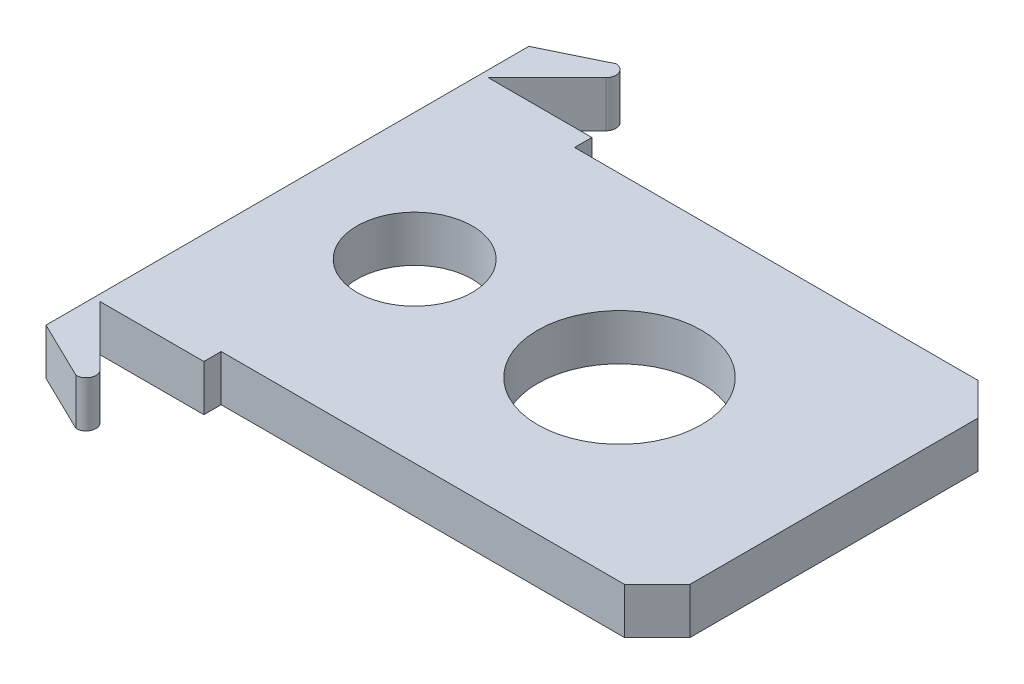
ISO-10303-21;
HEADER;
FILE_DESCRIPTION(('STEP AP214'),'2;1');
FILE_NAME('part.step','',(''),(''),'','','');
FILE_SCHEMA(('AUTOMOTIVE_DESIGN { 1 0 10303 214 1 1 1 1 }'));
ENDSEC;
DATA;
#1=APPLICATION_CONTEXT('core data for automotive mechanical design processes');
#2=APPLICATION_PROTOCOL_DEFINITION('international standard','automotive_design',2000,#1);
#3=PRODUCT_CONTEXT('',#1,'mechanical');
#4=PRODUCT('Part','Part','',(#3));
#5=PRODUCT_RELATED_PRODUCT_CATEGORY('part','',(#4));
#6=PRODUCT_DEFINITION_FORMATION('','',#4);
#7=PRODUCT_DEFINITION_CONTEXT('part definition',#1,'design');
#8=PRODUCT_DEFINITION('design','',#6,#7);
#9=PRODUCT_DEFINITION_SHAPE('','',#8);
#10=(LENGTH_UNIT() NAMED_UNIT(*) SI_UNIT(.MILLI.,.METRE.));
#11=(NAMED_UNIT(*) PLANE_ANGLE_UNIT() SI_UNIT($,.RADIAN.));
#12=(NAMED_UNIT(*) SI_UNIT($,.STERADIAN.) SOLID_ANGLE_UNIT());
#13=UNCERTAINTY_MEASURE_WITH_UNIT(LENGTH_MEASURE(1.E-05),#10,'distance_accuracy_value','');
#14=(GEOMETRIC_REPRESENTATION_CONTEXT(3) GLOBAL_UNCERTAINTY_ASSIGNED_CONTEXT((#13)) GLOBAL_UNIT_ASSIGNED_CONTEXT((#10,
#11,#12)) REPRESENTATION_CONTEXT('',''));
#15=CARTESIAN_POINT('',(0.,0.,0.));
#16=DIRECTION('',(0.,0.,1.));
#17=DIRECTION('',(1.,0.,0.));
#18=AXIS2_PLACEMENT_3D('',#15,#16,#17);
#19=CARTESIAN_POINT('',(41.5549931695034,0.8,-4.5103185666873));
#20=DIRECTION('',(0.,1.,0.));
#21=DIRECTION('',(0.,0.,1.));
#22=AXIS2_PLACEMENT_3D('',#19,#20,#21);
#23=PLANE('',#22);
#24=CARTESIAN_POINT('',(42.7464889215796,0.8,0.));
#25=DIRECTION('',(0.,1.,0.));
#26=DIRECTION('',(0.,0.,1.));
#27=AXIS2_PLACEMENT_3D('',#24,#25,#26);
#28=CIRCLE('',#27,0.999999999999998);
#29=CARTESIAN_POINT('',(42.7464889215796,0.8,0.999999999999998));
#30=VERTEX_POINT('',#29);
#31=EDGE_CURVE('E282',#30,#30,#28,.T.);
#32=ORIENTED_EDGE('',*,*,#31,.F.);
#33=EDGE_LOOP('',(#32));
#34=FACE_BOUND('',#33,.T.);
#35=DIRECTION('',(-0.899104373655111,0.,-0.437734308998335));
#36=VECTOR('',#35,1.);
#37=CARTESIAN_POINT('',(41.5549931695034,0.8,4.68330032011326));
#38=LINE('',#37,#36);
#39=CARTESIAN_POINT('',(41.5549931695034,0.8,4.68330032011325));
#40=VERTEX_POINT('',#39);
#41=CARTESIAN_POINT('',(40.5393091511646,0.8,4.18880851809836));
#42=VERTEX_POINT('',#41);
#43=EDGE_CURVE('E318',#40,#42,#38,.T.);
#44=ORIENTED_EDGE('',*,*,#43,.F.);
#45=CARTESIAN_POINT('',(41.5549931695034,0.8,4.5103185666873));
#46=DIRECTION('',(0.,-1.,0.));
#47=DIRECTION('',(0.,0.,-1.));
#48=AXIS2_PLACEMENT_3D('',#45,#46,#47);
#49=CIRCLE('',#48,0.172981753425953);
#50=CARTESIAN_POINT('',(41.6773097403724,0.8,4.38800199581827));
#51=VERTEX_POINT('',#50);
#52=EDGE_CURVE('E273',#51,#40,#49,.T.);
#53=ORIENTED_EDGE('',*,*,#52,.F.);
#54=DIRECTION('',(0.707106781186547,0.,0.707106781186548));
#55=VECTOR('',#54,1.);
#56=CARTESIAN_POINT('',(40.6549931695034,0.8,3.36568542494924));
#57=LINE('',#56,#55);
#58=CARTESIAN_POINT('',(40.6549931695034,0.8,3.36568542494924));
#59=VERTEX_POINT('',#58);
#60=EDGE_CURVE('E257',#59,#51,#57,.T.);
#61=ORIENTED_EDGE('',*,*,#60,.F.);
#62=DIRECTION('',(1.,0.,0.));
#63=VECTOR('',#62,1.);
#64=CARTESIAN_POINT('',(40.6549931695034,0.8,3.36568542494924));
#65=LINE('',#64,#63);
#66=CARTESIAN_POINT('',(42.4549931695034,0.8,3.36568542494924));
#67=VERTEX_POINT('',#66);
#68=EDGE_CURVE('E265',#59,#67,#65,.T.);
#69=ORIENTED_EDGE('',*,*,#68,.T.);
#70=DIRECTION('',(0.,0.,-1.));
#71=VECTOR('',#70,1.);
#72=CARTESIAN_POINT('',(42.4549931695034,0.8,3.36568542494924));
#73=LINE('',#72,#71);
#74=CARTESIAN_POINT('',(42.4549931695034,0.8,3.06568542494924));
#75=VERTEX_POINT('',#74);
#76=EDGE_CURVE('E270',#67,#75,#73,.T.);
#77=ORIENTED_EDGE('',*,*,#76,.T.);
#78=DIRECTION('',(1.,0.,0.));
#79=VECTOR('',#78,1.);
#80=CARTESIAN_POINT('',(42.4549931695034,0.8,3.06568542494924));
#81=LINE('',#80,#79);
#82=CARTESIAN_POINT('',(49.4549931695034,0.8,3.06568542494924));
#83=VERTEX_POINT('',#82);
#84=EDGE_CURVE('E420',#75,#83,#81,.T.);
#85=ORIENTED_EDGE('',*,*,#84,.T.);
#86=DIRECTION('',(0.707106781186548,0.,-0.707106781186548));
#87=VECTOR('',#86,1.);
#88=CARTESIAN_POINT('',(49.4549931695034,0.8,3.06568542494924));
#89=LINE('',#88,#87);
#90=CARTESIAN_POINT('',(50.0206785944526,0.8,2.5));
#91=VERTEX_POINT('',#90);
#92=EDGE_CURVE('E418',#83,#91,#89,.T.);
#93=ORIENTED_EDGE('',*,*,#92,.T.);
#94=DIRECTION('',(0.,0.,-1.));
#95=VECTOR('',#94,1.);
#96=CARTESIAN_POINT('',(50.0206785944526,0.8,2.5));
#97=LINE('',#96,#95);
#98=CARTESIAN_POINT('',(50.0206785944526,0.8,-2.5));
#99=VERTEX_POINT('',#98);
#100=EDGE_CURVE('E416',#91,#99,#97,.T.);
#101=ORIENTED_EDGE('',*,*,#100,.T.);
#102=DIRECTION('',(0.707106781186548,0.,0.707106781186548));
#103=VECTOR('',#102,1.);
#104=CARTESIAN_POINT('',(49.4549931695034,0.8,-3.06568542494924));
#105=LINE('',#104,#103);
#106=CARTESIAN_POINT('',(49.4549931695034,0.8,-3.06568542494924));
#107=VERTEX_POINT('',#106);
#108=EDGE_CURVE('E413',#107,#99,#105,.T.);
#109=ORIENTED_EDGE('',*,*,#108,.F.);
#110=DIRECTION('',(1.,0.,0.));
#111=VECTOR('',#110,1.);
#112=CARTESIAN_POINT('',(42.4549931695034,0.8,-3.06568542494924));
#113=LINE('',#112,#111);
#114=CARTESIAN_POINT('',(42.4549931695034,0.8,-3.06568542494924));
#115=VERTEX_POINT('',#114);
#116=EDGE_CURVE('E410',#115,#107,#113,.T.);
#117=ORIENTED_EDGE('',*,*,#116,.F.);
#118=DIRECTION('',(0.,0.,1.));
#119=VECTOR('',#118,1.);
#120=CARTESIAN_POINT('',(42.4549931695034,0.8,-3.36568542494924));
#121=LINE('',#120,#119);
#122=CARTESIAN_POINT('',(42.4549931695034,0.8,-3.36568542494924));
#123=VERTEX_POINT('',#122);
#124=EDGE_CURVE('E407',#123,#115,#121,.T.);
#125=ORIENTED_EDGE('',*,*,#124,.F.);
#126=DIRECTION('',(1.,0.,0.));
#127=VECTOR('',#126,1.);
#128=CARTESIAN_POINT('',(40.6549931695034,0.8,-3.36568542494924));
#129=LINE('',#128,#127);
#130=CARTESIAN_POINT('',(40.6549931695034,0.8,-3.36568542494924));
#131=VERTEX_POINT('',#130);
#132=EDGE_CURVE('E404',#131,#123,#129,.T.);
#133=ORIENTED_EDGE('',*,*,#132,.F.);
#134=DIRECTION('',(0.707106781186547,0.,-0.707106781186548));
#135=VECTOR('',#134,1.);
#136=CARTESIAN_POINT('',(40.6549931695034,0.8,-3.36568542494924));
#137=LINE('',#136,#135);
#138=CARTESIAN_POINT('',(41.6773097403724,0.8,-4.38800199581827));
#139=VERTEX_POINT('',#138);
#140=EDGE_CURVE('E402',#131,#139,#137,.T.);
#141=ORIENTED_EDGE('',*,*,#140,.T.);
#142=CARTESIAN_POINT('',(41.5549931695034,0.8,-4.5103185666873));
#143=DIRECTION('',(0.,1.,0.));
#144=DIRECTION('',(0.,0.,1.));
#145=AXIS2_PLACEMENT_3D('',#142,#143,#144);
#146=CIRCLE('',#145,0.172981753425953);
#147=CARTESIAN_POINT('',(41.5549931695034,0.8,-4.68330032011326));
#148=VERTEX_POINT('',#147);
#149=EDGE_CURVE('E400',#139,#148,#146,.T.);
#150=ORIENTED_EDGE('',*,*,#149,.T.);
#151=DIRECTION('',(-0.899104373655111,0.,0.437734308998335));
#152=VECTOR('',#151,1.);
#153=CARTESIAN_POINT('',(41.5549931695034,0.8,-4.68330032011326));
#154=LINE('',#153,#152);
#155=CARTESIAN_POINT('',(40.5393091511646,0.8,-4.18880851809836));
#156=VERTEX_POINT('',#155);
#157=EDGE_CURVE('E398',#148,#156,#154,.T.);
#158=ORIENTED_EDGE('',*,*,#157,.T.);
#159=DIRECTION('',(0.,0.,-1.));
#160=VECTOR('',#159,1.);
#161=CARTESIAN_POINT('',(40.5393091511646,0.8,4.18880851809836));
#162=LINE('',#161,#160);
#163=EDGE_CURVE('E396',#42,#156,#162,.T.);
#164=ORIENTED_EDGE('',*,*,#163,.F.);
#165=EDGE_LOOP('',(#44,#53,#61,#69,#77,#85,#93,#101,#109,#117,#125,#133,#141,#150,#158,#164));
#166=FACE_BOUND('',#165,.T.);
#167=CARTESIAN_POINT('',(46.3010211073046,0.8,0.));
#168=DIRECTION('',(0.,1.,0.));
#169=DIRECTION('',(0.,0.,1.));
#170=AXIS2_PLACEMENT_3D('',#167,#168,#169);
#171=CIRCLE('',#170,1.42136871243155);
#172=CARTESIAN_POINT('',(46.3010211073046,0.8,1.42136871243155));
#173=VERTEX_POINT('',#172);
#174=EDGE_CURVE('E383',#173,#173,#171,.T.);
#175=ORIENTED_EDGE('',*,*,#174,.F.);
#176=EDGE_LOOP('',(#175));
#177=FACE_BOUND('',#176,.T.);
#178=ADVANCED_FACE('F135',(#34,#166,#177),#23,.T.);
#179=CARTESIAN_POINT('',(41.5549931695034,0.,-4.5103185666873));
#180=DIRECTION('',(0.,1.,0.));
#181=DIRECTION('',(0.,0.,1.));
#182=AXIS2_PLACEMENT_3D('',#179,#180,#181);
#183=PLANE('',#182);
#184=CARTESIAN_POINT('',(42.7464889215796,0.,0.));
#185=DIRECTION('',(0.,1.,0.));
#186=DIRECTION('',(0.,0.,1.));
#187=AXIS2_PLACEMENT_3D('',#184,#185,#186);
#188=CIRCLE('',#187,0.999999999999998);
#189=CARTESIAN_POINT('',(42.7464889215796,0.,0.999999999999998));
#190=VERTEX_POINT('',#189);
#191=EDGE_CURVE('E388',#190,#190,#188,.T.);
#192=ORIENTED_EDGE('',*,*,#191,.T.);
#193=EDGE_LOOP('',(#192));
#194=FACE_BOUND('',#193,.T.);
#195=DIRECTION('',(-0.899104373655111,0.,-0.437734308998335));
#196=VECTOR('',#195,1.);
#197=CARTESIAN_POINT('',(41.5549931695034,0.,4.68330032011326));
#198=LINE('',#197,#196);
#199=CARTESIAN_POINT('',(41.5549931695034,0.,4.68330032011325));
#200=VERTEX_POINT('',#199);
#201=CARTESIAN_POINT('',(40.5393091511646,0.,4.18880851809836));
#202=VERTEX_POINT('',#201);
#203=EDGE_CURVE('E278',#200,#202,#198,.T.);
#204=ORIENTED_EDGE('',*,*,#203,.T.);
#205=DIRECTION('',(0.,0.,-1.));
#206=VECTOR('',#205,1.);
#207=CARTESIAN_POINT('',(40.5393091511646,0.,4.18880851809836));
#208=LINE('',#207,#206);
#209=CARTESIAN_POINT('',(40.5393091511646,0.,-4.18880851809836));
#210=VERTEX_POINT('',#209);
#211=EDGE_CURVE('E281',#202,#210,#208,.T.);
#212=ORIENTED_EDGE('',*,*,#211,.T.);
#213=DIRECTION('',(-0.899104373655111,0.,0.437734308998335));
#214=VECTOR('',#213,1.);
#215=CARTESIAN_POINT('',(41.5549931695034,0.,-4.68330032011326));
#216=LINE('',#215,#214);
#217=CARTESIAN_POINT('',(41.5549931695034,0.,-4.68330032011326));
#218=VERTEX_POINT('',#217);
#219=EDGE_CURVE('E285',#218,#210,#216,.T.);
#220=ORIENTED_EDGE('',*,*,#219,.F.);
#221=CARTESIAN_POINT('',(41.5549931695034,0.,-4.5103185666873));
#222=DIRECTION('',(0.,1.,0.));
#223=DIRECTION('',(0.,0.,1.));
#224=AXIS2_PLACEMENT_3D('',#221,#222,#223);
#225=CIRCLE('',#224,0.172981753425953);
#226=CARTESIAN_POINT('',(41.6773097403724,0.,-4.38800199581827));
#227=VERTEX_POINT('',#226);
#228=EDGE_CURVE('E288',#227,#218,#225,.T.);
#229=ORIENTED_EDGE('',*,*,#228,.F.);
#230=DIRECTION('',(0.707106781186547,0.,-0.707106781186548));
#231=VECTOR('',#230,1.);
#232=CARTESIAN_POINT('',(40.6549931695034,0.,-3.36568542494924));
#233=LINE('',#232,#231);
#234=CARTESIAN_POINT('',(40.6549931695034,0.,-3.36568542494924));
#235=VERTEX_POINT('',#234);
#236=EDGE_CURVE('E290',#235,#227,#233,.T.);
#237=ORIENTED_EDGE('',*,*,#236,.F.);
#238=DIRECTION('',(1.,0.,0.));
#239=VECTOR('',#238,1.);
#240=CARTESIAN_POINT('',(40.6549931695034,0.,-3.36568542494924));
#241=LINE('',#240,#239);
#242=CARTESIAN_POINT('',(42.4549931695034,0.,-3.36568542494924));
#243=VERTEX_POINT('',#242);
#244=EDGE_CURVE('E292',#235,#243,#241,.T.);
#245=ORIENTED_EDGE('',*,*,#244,.T.);
#246=DIRECTION('',(0.,0.,1.));
#247=VECTOR('',#246,1.);
#248=CARTESIAN_POINT('',(42.4549931695034,0.,-3.36568542494924));
#249=LINE('',#248,#247);
#250=CARTESIAN_POINT('',(42.4549931695034,0.,-3.06568542494924));
#251=VERTEX_POINT('',#250);
#252=EDGE_CURVE('E295',#243,#251,#249,.T.);
#253=ORIENTED_EDGE('',*,*,#252,.T.);
#254=DIRECTION('',(1.,0.,0.));
#255=VECTOR('',#254,1.);
#256=CARTESIAN_POINT('',(42.4549931695034,0.,-3.06568542494924));
#257=LINE('',#256,#255);
#258=CARTESIAN_POINT('',(49.4549931695034,0.,-3.06568542494924));
#259=VERTEX_POINT('',#258);
#260=EDGE_CURVE('E298',#251,#259,#257,.T.);
#261=ORIENTED_EDGE('',*,*,#260,.T.);
#262=DIRECTION('',(0.707106781186548,0.,0.707106781186548));
#263=VECTOR('',#262,1.);
#264=CARTESIAN_POINT('',(49.4549931695034,0.,-3.06568542494924));
#265=LINE('',#264,#263);
#266=CARTESIAN_POINT('',(50.0206785944526,0.,-2.5));
#267=VERTEX_POINT('',#266);
#268=EDGE_CURVE('E301',#259,#267,#265,.T.);
#269=ORIENTED_EDGE('',*,*,#268,.T.);
#270=DIRECTION('',(0.,0.,-1.));
#271=VECTOR('',#270,1.);
#272=CARTESIAN_POINT('',(50.0206785944526,0.,2.5));
#273=LINE('',#272,#271);
#274=CARTESIAN_POINT('',(50.0206785944526,0.,2.5));
#275=VERTEX_POINT('',#274);
#276=EDGE_CURVE('E304',#275,#267,#273,.T.);
#277=ORIENTED_EDGE('',*,*,#276,.F.);
#278=DIRECTION('',(0.707106781186548,0.,-0.707106781186548));
#279=VECTOR('',#278,1.);
#280=CARTESIAN_POINT('',(49.4549931695034,0.,3.06568542494924));
#281=LINE('',#280,#279);
#282=CARTESIAN_POINT('',(49.4549931695034,0.,3.06568542494924));
#283=VERTEX_POINT('',#282);
#284=EDGE_CURVE('E307',#283,#275,#281,.T.);
#285=ORIENTED_EDGE('',*,*,#284,.F.);
#286=DIRECTION('',(1.,0.,0.));
#287=VECTOR('',#286,1.);
#288=CARTESIAN_POINT('',(42.4549931695034,0.,3.06568542494924));
#289=LINE('',#288,#287);
#290=CARTESIAN_POINT('',(42.4549931695034,0.,3.06568542494924));
#291=VERTEX_POINT('',#290);
#292=EDGE_CURVE('E309',#291,#283,#289,.T.);
#293=ORIENTED_EDGE('',*,*,#292,.F.);
#294=DIRECTION('',(0.,0.,-1.));
#295=VECTOR('',#294,1.);
#296=CARTESIAN_POINT('',(42.4549931695034,0.,3.36568542494924));
#297=LINE('',#296,#295);
#298=CARTESIAN_POINT('',(42.4549931695034,0.,3.36568542494924));
#299=VERTEX_POINT('',#298);
#300=EDGE_CURVE('E311',#299,#291,#297,.T.);
#301=ORIENTED_EDGE('',*,*,#300,.F.);
#302=DIRECTION('',(1.,0.,0.));
#303=VECTOR('',#302,1.);
#304=CARTESIAN_POINT('',(40.6549931695034,0.,3.36568542494924));
#305=LINE('',#304,#303);
#306=CARTESIAN_POINT('',(40.6549931695034,0.,3.36568542494924));
#307=VERTEX_POINT('',#306);
#308=EDGE_CURVE('E313',#307,#299,#305,.T.);
#309=ORIENTED_EDGE('',*,*,#308,.F.);
#310=DIRECTION('',(0.707106781186547,0.,0.707106781186548));
#311=VECTOR('',#310,1.);
#312=CARTESIAN_POINT('',(40.6549931695034,0.,3.36568542494924));
#313=LINE('',#312,#311);
#314=CARTESIAN_POINT('',(41.6773097403724,0.,4.38800199581827));
#315=VERTEX_POINT('',#314);
#316=EDGE_CURVE('E259',#307,#315,#313,.T.);
#317=ORIENTED_EDGE('',*,*,#316,.T.);
#318=CARTESIAN_POINT('',(41.5549931695034,0.,4.5103185666873));
#319=DIRECTION('',(0.,-1.,0.));
#320=DIRECTION('',(0.,0.,-1.));
#321=AXIS2_PLACEMENT_3D('',#318,#319,#320);
#322=CIRCLE('',#321,0.172981753425953);
#323=EDGE_CURVE('E316',#315,#200,#322,.T.);
#324=ORIENTED_EDGE('',*,*,#323,.T.);
#325=EDGE_LOOP('',(#204,#212,#220,#229,#237,#245,#253,#261,#269,#277,#285,#293,#301,#309,#317,#324));
#326=FACE_BOUND('',#325,.T.);
#327=CARTESIAN_POINT('',(46.3010211073046,0.,0.));
#328=DIRECTION('',(0.,1.,0.));
#329=DIRECTION('',(0.,0.,1.));
#330=AXIS2_PLACEMENT_3D('',#327,#328,#329);
#331=CIRCLE('',#330,1.42136871243155);
#332=CARTESIAN_POINT('',(46.3010211073046,0.,1.42136871243155));
#333=VERTEX_POINT('',#332);
#334=EDGE_CURVE('E386',#333,#333,#331,.T.);
#335=ORIENTED_EDGE('',*,*,#334,.T.);
#336=EDGE_LOOP('',(#335));
#337=FACE_BOUND('',#336,.T.);
#338=ADVANCED_FACE('F351',(#194,#326,#337),#183,.F.);
#339=CARTESIAN_POINT('',(41.5549931695034,0.8,4.68330032011326));
#340=DIRECTION('',(-0.437734308998335,0.,0.899104373655111));
#341=DIRECTION('',(0.899104373655112,0.,0.437734308998335));
#342=AXIS2_PLACEMENT_3D('',#339,#340,#341);
#343=PLANE('',#342);
#344=ORIENTED_EDGE('',*,*,#203,.F.);
#345=DIRECTION('',(0.,-1.,0.));
#346=VECTOR('',#345,1.);
#347=CARTESIAN_POINT('',(41.5549931695034,0.8,4.68330032011325));
#348=LINE('',#347,#346);
#349=EDGE_CURVE('E12',#40,#200,#348,.T.);
#350=ORIENTED_EDGE('',*,*,#349,.F.);
#351=ORIENTED_EDGE('',*,*,#43,.T.);
#352=DIRECTION('',(0.,-1.,0.));
#353=VECTOR('',#352,1.);
#354=CARTESIAN_POINT('',(40.5393091511646,0.8,4.18880851809836));
#355=LINE('',#354,#353);
#356=EDGE_CURVE('E139',#42,#202,#355,.T.);
#357=ORIENTED_EDGE('',*,*,#356,.T.);
#358=EDGE_LOOP('',(#344,#350,#351,#357));
#359=FACE_BOUND('',#358,.T.);
#360=ADVANCED_FACE('F137',(#359),#343,.T.);
#361=CARTESIAN_POINT('',(41.5549931695034,0.8,4.5103185666873));
#362=DIRECTION('',(0.,-1.,0.));
#363=DIRECTION('',(0.,0.,-1.));
#364=AXIS2_PLACEMENT_3D('',#361,#362,#363);
#365=CYLINDRICAL_SURFACE('',#364,0.172981753425953);
#366=ORIENTED_EDGE('',*,*,#323,.F.);
#367=DIRECTION('',(0.,-1.,0.));
#368=VECTOR('',#367,1.);
#369=CARTESIAN_POINT('',(41.6773097403724,0.8,4.38800199581827));
#370=LINE('',#369,#368);
#371=EDGE_CURVE('E145',#51,#315,#370,.T.);
#372=ORIENTED_EDGE('',*,*,#371,.F.);
#373=ORIENTED_EDGE('',*,*,#52,.T.);
#374=ORIENTED_EDGE('',*,*,#349,.T.);
#375=EDGE_LOOP('',(#366,#372,#373,#374));
#376=FACE_BOUND('',#375,.T.);
#377=ADVANCED_FACE('F353',(#376),#365,.T.);
#378=CARTESIAN_POINT('',(40.6549931695034,0.8,3.36568542494924));
#379=DIRECTION('',(0.707106781186548,0.,-0.707106781186547));
#380=DIRECTION('',(-0.707106781186547,0.,-0.707106781186548));
#381=AXIS2_PLACEMENT_3D('',#378,#379,#380);
#382=PLANE('',#381);
#383=ORIENTED_EDGE('',*,*,#316,.F.);
#384=DIRECTION('',(0.,-1.,0.));
#385=VECTOR('',#384,1.);
#386=CARTESIAN_POINT('',(40.6549931695034,0.8,3.36568542494924));
#387=LINE('',#386,#385);
#388=EDGE_CURVE('E253',#59,#307,#387,.T.);
#389=ORIENTED_EDGE('',*,*,#388,.F.);
#390=ORIENTED_EDGE('',*,*,#60,.T.);
#391=ORIENTED_EDGE('',*,*,#371,.T.);
#392=EDGE_LOOP('',(#383,#389,#390,#391));
#393=FACE_BOUND('',#392,.T.);
#394=ADVANCED_FACE('F255',(#393),#382,.T.);
#395=CARTESIAN_POINT('',(40.6549931695034,0.8,3.36568542494924));
#396=DIRECTION('',(0.,0.,-1.));
#397=DIRECTION('',(-1.,0.,0.));
#398=AXIS2_PLACEMENT_3D('',#395,#396,#397);
#399=PLANE('',#398);
#400=ORIENTED_EDGE('',*,*,#308,.T.);
#401=DIRECTION('',(0.,-1.,0.));
#402=VECTOR('',#401,1.);
#403=CARTESIAN_POINT('',(42.4549931695034,0.8,3.36568542494924));
#404=LINE('',#403,#402);
#405=EDGE_CURVE('E262',#67,#299,#404,.T.);
#406=ORIENTED_EDGE('',*,*,#405,.F.);
#407=ORIENTED_EDGE('',*,*,#68,.F.);
#408=ORIENTED_EDGE('',*,*,#388,.T.);
#409=EDGE_LOOP('',(#400,#406,#407,#408));
#410=FACE_BOUND('',#409,.T.);
#411=ADVANCED_FACE('F266',(#410),#399,.F.);
#412=CARTESIAN_POINT('',(42.4549931695034,0.8,3.36568542494924));
#413=DIRECTION('',(-1.,0.,0.));
#414=DIRECTION('',(0.,0.,1.));
#415=AXIS2_PLACEMENT_3D('',#412,#413,#414);
#416=PLANE('',#415);
#417=ORIENTED_EDGE('',*,*,#300,.T.);
#418=DIRECTION('',(0.,-1.,0.));
#419=VECTOR('',#418,1.);
#420=CARTESIAN_POINT('',(42.4549931695034,0.8,3.06568542494924));
#421=LINE('',#420,#419);
#422=EDGE_CURVE('E322',#75,#291,#421,.T.);
#423=ORIENTED_EDGE('',*,*,#422,.F.);
#424=ORIENTED_EDGE('',*,*,#76,.F.);
#425=ORIENTED_EDGE('',*,*,#405,.T.);
#426=EDGE_LOOP('',(#417,#423,#424,#425));
#427=FACE_BOUND('',#426,.T.);
#428=ADVANCED_FACE('F425',(#427),#416,.F.);
#429=CARTESIAN_POINT('',(42.4549931695034,0.8,3.06568542494924));
#430=DIRECTION('',(0.,0.,-1.));
#431=DIRECTION('',(-1.,0.,0.));
#432=AXIS2_PLACEMENT_3D('',#429,#430,#431);
#433=PLANE('',#432);
#434=ORIENTED_EDGE('',*,*,#292,.T.);
#435=DIRECTION('',(0.,-1.,0.));
#436=VECTOR('',#435,1.);
#437=CARTESIAN_POINT('',(49.4549931695034,0.8,3.06568542494924));
#438=LINE('',#437,#436);
#439=EDGE_CURVE('E325',#83,#283,#438,.T.);
#440=ORIENTED_EDGE('',*,*,#439,.F.);
#441=ORIENTED_EDGE('',*,*,#84,.F.);
#442=ORIENTED_EDGE('',*,*,#422,.T.);
#443=EDGE_LOOP('',(#434,#440,#441,#442));
#444=FACE_BOUND('',#443,.T.);
#445=ADVANCED_FACE('F429',(#444),#433,.F.);
#446=CARTESIAN_POINT('',(49.4549931695034,0.8,3.06568542494924));
#447=DIRECTION('',(-0.707106781186548,0.,-0.707106781186548));
#448=DIRECTION('',(-0.707106781186548,0.,0.707106781186548));
#449=AXIS2_PLACEMENT_3D('',#446,#447,#448);
#450=PLANE('',#449);
#451=ORIENTED_EDGE('',*,*,#284,.T.);
#452=DIRECTION('',(0.,-1.,0.));
#453=VECTOR('',#452,1.);
#454=CARTESIAN_POINT('',(50.0206785944526,0.8,2.5));
#455=LINE('',#454,#453);
#456=EDGE_CURVE('E328',#91,#275,#455,.T.);
#457=ORIENTED_EDGE('',*,*,#456,.F.);
#458=ORIENTED_EDGE('',*,*,#92,.F.);
#459=ORIENTED_EDGE('',*,*,#439,.T.);
#460=EDGE_LOOP('',(#451,#457,#458,#459));
#461=FACE_BOUND('',#460,.T.);
#462=ADVANCED_FACE('F434',(#461),#450,.F.);
#463=CARTESIAN_POINT('',(50.0206785944526,0.8,2.5));
#464=DIRECTION('',(-1.,0.,0.));
#465=DIRECTION('',(0.,0.,1.));
#466=AXIS2_PLACEMENT_3D('',#463,#464,#465);
#467=PLANE('',#466);
#468=ORIENTED_EDGE('',*,*,#276,.T.);
#469=DIRECTION('',(0.,-1.,0.));
#470=VECTOR('',#469,1.);
#471=CARTESIAN_POINT('',(50.0206785944526,0.8,-2.5));
#472=LINE('',#471,#470);
#473=EDGE_CURVE('E331',#99,#267,#472,.T.);
#474=ORIENTED_EDGE('',*,*,#473,.F.);
#475=ORIENTED_EDGE('',*,*,#100,.F.);
#476=ORIENTED_EDGE('',*,*,#456,.T.);
#477=EDGE_LOOP('',(#468,#474,#475,#476));
#478=FACE_BOUND('',#477,.T.);
#479=ADVANCED_FACE('F440',(#478),#467,.F.);
#480=CARTESIAN_POINT('',(49.4549931695034,0.8,-3.06568542494924));
#481=DIRECTION('',(0.707106781186548,0.,-0.707106781186548));
#482=DIRECTION('',(-0.707106781186548,0.,-0.707106781186548));
#483=AXIS2_PLACEMENT_3D('',#480,#481,#482);
#484=PLANE('',#483);
#485=ORIENTED_EDGE('',*,*,#268,.F.);
#486=DIRECTION('',(0.,-1.,0.));
#487=VECTOR('',#486,1.);
#488=CARTESIAN_POINT('',(49.4549931695034,0.8,-3.06568542494924));
#489=LINE('',#488,#487);
#490=EDGE_CURVE('E333',#107,#259,#489,.T.);
#491=ORIENTED_EDGE('',*,*,#490,.F.);
#492=ORIENTED_EDGE('',*,*,#108,.T.);
#493=ORIENTED_EDGE('',*,*,#473,.T.);
#494=EDGE_LOOP('',(#485,#491,#492,#493));
#495=FACE_BOUND('',#494,.T.);
#496=ADVANCED_FACE('F444',(#495),#484,.T.);
#497=CARTESIAN_POINT('',(42.4549931695034,0.8,-3.06568542494924));
#498=DIRECTION('',(0.,0.,-1.));
#499=DIRECTION('',(-1.,0.,0.));
#500=AXIS2_PLACEMENT_3D('',#497,#498,#499);
#501=PLANE('',#500);
#502=ORIENTED_EDGE('',*,*,#260,.F.);
#503=DIRECTION('',(0.,-1.,0.));
#504=VECTOR('',#503,1.);
#505=CARTESIAN_POINT('',(42.4549931695034,0.8,-3.06568542494924));
#506=LINE('',#505,#504);
#507=EDGE_CURVE('E335',#115,#251,#506,.T.);
#508=ORIENTED_EDGE('',*,*,#507,.F.);
#509=ORIENTED_EDGE('',*,*,#116,.T.);
#510=ORIENTED_EDGE('',*,*,#490,.T.);
#511=EDGE_LOOP('',(#502,#508,#509,#510));
#512=FACE_BOUND('',#511,.T.);
#513=ADVANCED_FACE('F447',(#512),#501,.T.);
#514=CARTESIAN_POINT('',(42.4549931695034,0.8,-3.36568542494924));
#515=DIRECTION('',(1.,0.,0.));
#516=DIRECTION('',(0.,0.,-1.));
#517=AXIS2_PLACEMENT_3D('',#514,#515,#516);
#518=PLANE('',#517);
#519=ORIENTED_EDGE('',*,*,#252,.F.);
#520=DIRECTION('',(0.,-1.,0.));
#521=VECTOR('',#520,1.);
#522=CARTESIAN_POINT('',(42.4549931695034,0.8,-3.36568542494924));
#523=LINE('',#522,#521);
#524=EDGE_CURVE('E337',#123,#243,#523,.T.);
#525=ORIENTED_EDGE('',*,*,#524,.F.);
#526=ORIENTED_EDGE('',*,*,#124,.T.);
#527=ORIENTED_EDGE('',*,*,#507,.T.);
#528=EDGE_LOOP('',(#519,#525,#526,#527));
#529=FACE_BOUND('',#528,.T.);
#530=ADVANCED_FACE('F452',(#529),#518,.T.);
#531=CARTESIAN_POINT('',(40.6549931695034,0.8,-3.36568542494924));
#532=DIRECTION('',(0.,0.,-1.));
#533=DIRECTION('',(-1.,0.,0.));
#534=AXIS2_PLACEMENT_3D('',#531,#532,#533);
#535=PLANE('',#534);
#536=ORIENTED_EDGE('',*,*,#244,.F.);
#537=DIRECTION('',(0.,-1.,0.));
#538=VECTOR('',#537,1.);
#539=CARTESIAN_POINT('',(40.6549931695034,0.8,-3.36568542494924));
#540=LINE('',#539,#538);
#541=EDGE_CURVE('E339',#131,#235,#540,.T.);
#542=ORIENTED_EDGE('',*,*,#541,.F.);
#543=ORIENTED_EDGE('',*,*,#132,.T.);
#544=ORIENTED_EDGE('',*,*,#524,.T.);
#545=EDGE_LOOP('',(#536,#542,#543,#544));
#546=FACE_BOUND('',#545,.T.);
#547=ADVANCED_FACE('F455',(#546),#535,.T.);
#548=CARTESIAN_POINT('',(40.6549931695034,0.8,-3.36568542494924));
#549=DIRECTION('',(-0.707106781186548,0.,-0.707106781186547));
#550=DIRECTION('',(-0.707106781186547,0.,0.707106781186548));
#551=AXIS2_PLACEMENT_3D('',#548,#549,#550);
#552=PLANE('',#551);
#553=ORIENTED_EDGE('',*,*,#236,.T.);
#554=DIRECTION('',(0.,-1.,0.));
#555=VECTOR('',#554,1.);
#556=CARTESIAN_POINT('',(41.6773097403724,0.8,-4.38800199581827));
#557=LINE('',#556,#555);
#558=EDGE_CURVE('E341',#139,#227,#557,.T.);
#559=ORIENTED_EDGE('',*,*,#558,.F.);
#560=ORIENTED_EDGE('',*,*,#140,.F.);
#561=ORIENTED_EDGE('',*,*,#541,.T.);
#562=EDGE_LOOP('',(#553,#559,#560,#561));
#563=FACE_BOUND('',#562,.T.);
#564=ADVANCED_FACE('F461',(#563),#552,.F.);
#565=CARTESIAN_POINT('',(41.5549931695034,0.8,-4.5103185666873));
#566=DIRECTION('',(0.,-1.,0.));
#567=DIRECTION('',(0.,0.,-1.));
#568=AXIS2_PLACEMENT_3D('',#565,#566,#567);
#569=CYLINDRICAL_SURFACE('',#568,0.172981753425953);
#570=ORIENTED_EDGE('',*,*,#228,.T.);
#571=DIRECTION('',(0.,-1.,0.));
#572=VECTOR('',#571,1.);
#573=CARTESIAN_POINT('',(41.5549931695034,0.8,-4.68330032011326));
#574=LINE('',#573,#572);
#575=EDGE_CURVE('E344',#148,#218,#574,.T.);
#576=ORIENTED_EDGE('',*,*,#575,.F.);
#577=ORIENTED_EDGE('',*,*,#149,.F.);
#578=ORIENTED_EDGE('',*,*,#558,.T.);
#579=EDGE_LOOP('',(#570,#576,#577,#578));
#580=FACE_BOUND('',#579,.T.);
#581=ADVANCED_FACE('F465',(#580),#569,.T.);
#582=CARTESIAN_POINT('',(41.5549931695034,0.8,-4.68330032011326));
#583=DIRECTION('',(0.437734308998335,0.,0.899104373655111));
#584=DIRECTION('',(0.899104373655112,0.,-0.437734308998335));
#585=AXIS2_PLACEMENT_3D('',#582,#583,#584);
#586=PLANE('',#585);
#587=ORIENTED_EDGE('',*,*,#219,.T.);
#588=DIRECTION('',(0.,-1.,0.));
#589=VECTOR('',#588,1.);
#590=CARTESIAN_POINT('',(40.5393091511646,0.8,-4.18880851809836));
#591=LINE('',#590,#589);
#592=EDGE_CURVE('E346',#156,#210,#591,.T.);
#593=ORIENTED_EDGE('',*,*,#592,.F.);
#594=ORIENTED_EDGE('',*,*,#157,.F.);
#595=ORIENTED_EDGE('',*,*,#575,.T.);
#596=EDGE_LOOP('',(#587,#593,#594,#595));
#597=FACE_BOUND('',#596,.T.);
#598=ADVANCED_FACE('F468',(#597),#586,.F.);
#599=CARTESIAN_POINT('',(40.5393091511646,0.8,4.18880851809836));
#600=DIRECTION('',(-1.,0.,0.));
#601=DIRECTION('',(0.,0.,1.));
#602=AXIS2_PLACEMENT_3D('',#599,#600,#601);
#603=PLANE('',#602);
#604=ORIENTED_EDGE('',*,*,#211,.F.);
#605=ORIENTED_EDGE('',*,*,#356,.F.);
#606=ORIENTED_EDGE('',*,*,#163,.T.);
#607=ORIENTED_EDGE('',*,*,#592,.T.);
#608=EDGE_LOOP('',(#604,#605,#606,#607));
#609=FACE_BOUND('',#608,.T.);
#610=ADVANCED_FACE('F348',(#609),#603,.T.);
#611=CARTESIAN_POINT('',(42.7464889215796,0.8,0.));
#612=DIRECTION('',(0.,-1.,0.));
#613=DIRECTION('',(0.,0.,-1.));
#614=AXIS2_PLACEMENT_3D('',#611,#612,#613);
#615=CYLINDRICAL_SURFACE('',#614,0.999999999999998);
#616=ORIENTED_EDGE('',*,*,#31,.T.);
#617=EDGE_LOOP('',(#616));
#618=FACE_BOUND('',#617,.T.);
#619=ORIENTED_EDGE('',*,*,#191,.F.);
#620=EDGE_LOOP('',(#619));
#621=FACE_BOUND('',#620,.T.);
#622=ADVANCED_FACE('F371',(#618,#621),#615,.F.);
#623=CARTESIAN_POINT('',(46.3010211073046,0.8,0.));
#624=DIRECTION('',(0.,-1.,0.));
#625=DIRECTION('',(0.,0.,-1.));
#626=AXIS2_PLACEMENT_3D('',#623,#624,#625);
#627=CYLINDRICAL_SURFACE('',#626,1.42136871243155);
#628=ORIENTED_EDGE('',*,*,#174,.T.);
#629=EDGE_LOOP('',(#628));
#630=FACE_BOUND('',#629,.T.);
#631=ORIENTED_EDGE('',*,*,#334,.F.);
#632=EDGE_LOOP('',(#631));
#633=FACE_BOUND('',#632,.T.);
#634=ADVANCED_FACE('F374',(#630,#633),#627,.F.);
#635=CLOSED_SHELL('',(#178,#338,#360,#377,#394,#411,#428,#445,#462,#479,#496,#513,#530,#547,
#564,#581,#598,#610,#622,#634));
#636=MANIFOLD_SOLID_BREP('B2',#635);
#637=ADVANCED_BREP_SHAPE_REPRESENTATION('',(#18,#636),#14);
#638=SHAPE_DEFINITION_REPRESENTATION(#9,#637);
ENDSEC;
END-ISO-10303-21;
